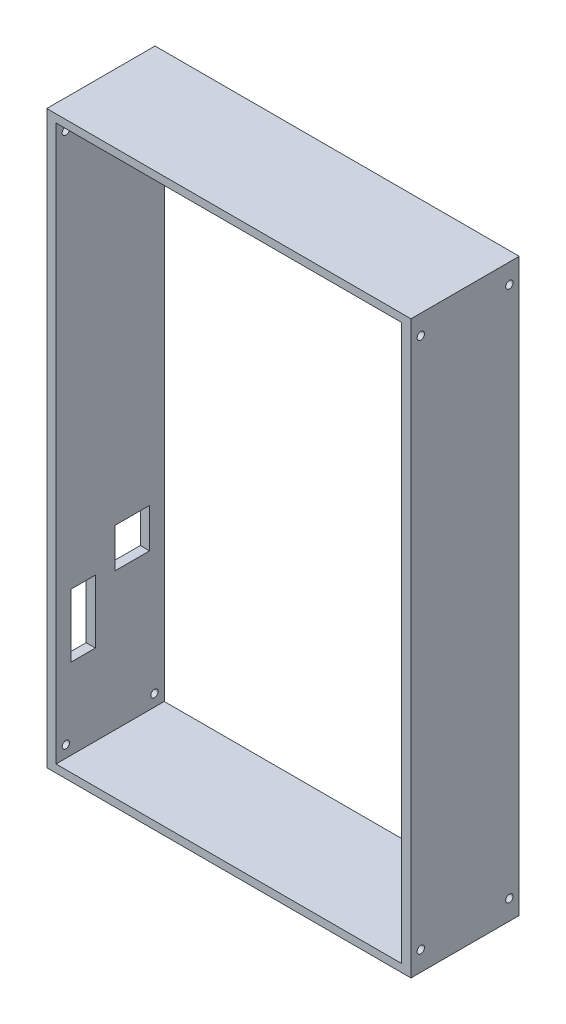
ISO-10303-21;
HEADER;
FILE_DESCRIPTION(('STEP AP214'),'2;1');
FILE_NAME('part.step','',(''),(''),'','','');
FILE_SCHEMA(('AUTOMOTIVE_DESIGN { 1 0 10303 214 1 1 1 1 }'));
ENDSEC;
DATA;
#1=APPLICATION_CONTEXT('core data for automotive mechanical design processes');
#2=APPLICATION_PROTOCOL_DEFINITION('international standard','automotive_design',2000,#1);
#3=PRODUCT_CONTEXT('',#1,'mechanical');
#4=PRODUCT('Part','Part','',(#3));
#5=PRODUCT_RELATED_PRODUCT_CATEGORY('part','',(#4));
#6=PRODUCT_DEFINITION_FORMATION('','',#4);
#7=PRODUCT_DEFINITION_CONTEXT('part definition',#1,'design');
#8=PRODUCT_DEFINITION('design','',#6,#7);
#9=PRODUCT_DEFINITION_SHAPE('','',#8);
#10=(LENGTH_UNIT() NAMED_UNIT(*) SI_UNIT(.MILLI.,.METRE.));
#11=(NAMED_UNIT(*) PLANE_ANGLE_UNIT() SI_UNIT($,.RADIAN.));
#12=(NAMED_UNIT(*) SI_UNIT($,.STERADIAN.) SOLID_ANGLE_UNIT());
#13=UNCERTAINTY_MEASURE_WITH_UNIT(LENGTH_MEASURE(1.E-05),#10,'distance_accuracy_value','');
#14=(GEOMETRIC_REPRESENTATION_CONTEXT(3) GLOBAL_UNCERTAINTY_ASSIGNED_CONTEXT((#13)) GLOBAL_UNIT_ASSIGNED_CONTEXT((#10,
#11,#12)) REPRESENTATION_CONTEXT('',''));
#15=CARTESIAN_POINT('',(0.,0.,0.));
#16=DIRECTION('',(0.,0.,1.));
#17=DIRECTION('',(1.,0.,0.));
#18=AXIS2_PLACEMENT_3D('',#15,#16,#17);
#19=CARTESIAN_POINT('',(0.,0.,34.925));
#20=DIRECTION('',(1.,0.,0.));
#21=DIRECTION('',(0.,0.,-1.));
#22=AXIS2_PLACEMENT_3D('',#19,#20,#21);
#23=PLANE('',#22);
#24=DIRECTION('',(0.,0.,1.));
#25=VECTOR('',#24,1.);
#26=CARTESIAN_POINT('',(0.,46.990100076,4.7625));
#27=LINE('',#26,#25);
#28=CARTESIAN_POINT('',(0.,46.990100076,4.7625));
#29=VERTEX_POINT('',#28);
#30=CARTESIAN_POINT('',(0.,46.990100076,15.875));
#31=VERTEX_POINT('',#30);
#32=EDGE_CURVE('E182',#29,#31,#27,.T.);
#33=ORIENTED_EDGE('',*,*,#32,.F.);
#34=DIRECTION('',(0.,-1.,0.));
#35=VECTOR('',#34,1.);
#36=CARTESIAN_POINT('',(0.,59.690100076,4.7625));
#37=LINE('',#36,#35);
#38=CARTESIAN_POINT('',(0.,59.690100076,4.7625));
#39=VERTEX_POINT('',#38);
#40=EDGE_CURVE('E48',#39,#29,#37,.T.);
#41=ORIENTED_EDGE('',*,*,#40,.F.);
#42=DIRECTION('',(0.,0.,-1.));
#43=VECTOR('',#42,1.);
#44=CARTESIAN_POINT('',(0.,59.690100076,4.7625));
#45=LINE('',#44,#43);
#46=CARTESIAN_POINT('',(0.,59.690100076,15.875));
#47=VERTEX_POINT('',#46);
#48=EDGE_CURVE('E188',#47,#39,#45,.T.);
#49=ORIENTED_EDGE('',*,*,#48,.F.);
#50=DIRECTION('',(0.,1.,0.));
#51=VECTOR('',#50,1.);
#52=CARTESIAN_POINT('',(0.,59.690100076,15.875));
#53=LINE('',#52,#51);
#54=EDGE_CURVE('E173',#31,#47,#53,.T.);
#55=ORIENTED_EDGE('',*,*,#54,.F.);
#56=EDGE_LOOP('',(#33,#41,#49,#55));
#57=FACE_BOUND('',#56,.T.);
#58=DIRECTION('',(0.,0.,1.));
#59=VECTOR('',#58,1.);
#60=CARTESIAN_POINT('',(0.,28.575100076,22.225));
#61=LINE('',#60,#59);
#62=CARTESIAN_POINT('',(0.,28.575100076,22.225));
#63=VERTEX_POINT('',#62);
#64=CARTESIAN_POINT('',(0.,28.575100076,30.1625));
#65=VERTEX_POINT('',#64);
#66=EDGE_CURVE('E199',#63,#65,#61,.T.);
#67=ORIENTED_EDGE('',*,*,#66,.F.);
#68=DIRECTION('',(0.,-1.,0.));
#69=VECTOR('',#68,1.);
#70=CARTESIAN_POINT('',(0.,48.958600076,22.225));
#71=LINE('',#70,#69);
#72=CARTESIAN_POINT('',(0.,48.958600076,22.225));
#73=VERTEX_POINT('',#72);
#74=EDGE_CURVE('E195',#73,#63,#71,.T.);
#75=ORIENTED_EDGE('',*,*,#74,.F.);
#76=DIRECTION('',(0.,0.,-1.));
#77=VECTOR('',#76,1.);
#78=CARTESIAN_POINT('',(0.,48.958600076,22.225));
#79=LINE('',#78,#77);
#80=CARTESIAN_POINT('',(0.,48.958600076,30.1625));
#81=VERTEX_POINT('',#80);
#82=EDGE_CURVE('E205',#81,#73,#79,.T.);
#83=ORIENTED_EDGE('',*,*,#82,.F.);
#84=DIRECTION('',(0.,1.,0.));
#85=VECTOR('',#84,1.);
#86=CARTESIAN_POINT('',(0.,48.958600076,30.1625));
#87=LINE('',#86,#85);
#88=EDGE_CURVE('E202',#65,#81,#87,.T.);
#89=ORIENTED_EDGE('',*,*,#88,.F.);
#90=EDGE_LOOP('',(#67,#75,#83,#89));
#91=FACE_BOUND('',#90,.T.);
#92=CARTESIAN_POINT('',(0.,6.34999999999999,31.75));
#93=DIRECTION('',(-1.,0.,0.));
#94=DIRECTION('',(0.,0.,1.));
#95=AXIS2_PLACEMENT_3D('',#92,#93,#94);
#96=CIRCLE('',#95,1.190625);
#97=CARTESIAN_POINT('',(0.,6.34999999999999,32.940625));
#98=VERTEX_POINT('',#97);
#99=EDGE_CURVE('E225',#98,#98,#96,.T.);
#100=ORIENTED_EDGE('',*,*,#99,.F.);
#101=EDGE_LOOP('',(#100));
#102=FACE_BOUND('',#101,.T.);
#103=CARTESIAN_POINT('',(0.,177.8,31.75));
#104=DIRECTION('',(-1.,0.,0.));
#105=DIRECTION('',(0.,0.,1.));
#106=AXIS2_PLACEMENT_3D('',#103,#104,#105);
#107=CIRCLE('',#106,1.19062500000001);
#108=CARTESIAN_POINT('',(0.,177.8,32.940625));
#109=VERTEX_POINT('',#108);
#110=EDGE_CURVE('E229',#109,#109,#107,.T.);
#111=ORIENTED_EDGE('',*,*,#110,.F.);
#112=EDGE_LOOP('',(#111));
#113=FACE_BOUND('',#112,.T.);
#114=CARTESIAN_POINT('',(0.,6.34999999999999,3.175));
#115=DIRECTION('',(-1.,0.,0.));
#116=DIRECTION('',(0.,0.,1.));
#117=AXIS2_PLACEMENT_3D('',#114,#115,#116);
#118=CIRCLE('',#117,1.190625);
#119=CARTESIAN_POINT('',(0.,6.34999999999999,4.365625));
#120=VERTEX_POINT('',#119);
#121=EDGE_CURVE('E233',#120,#120,#118,.T.);
#122=ORIENTED_EDGE('',*,*,#121,.F.);
#123=EDGE_LOOP('',(#122));
#124=FACE_BOUND('',#123,.T.);
#125=CARTESIAN_POINT('',(0.,177.8,3.175));
#126=DIRECTION('',(-1.,0.,0.));
#127=DIRECTION('',(0.,0.,1.));
#128=AXIS2_PLACEMENT_3D('',#125,#126,#127);
#129=CIRCLE('',#128,1.190625);
#130=CARTESIAN_POINT('',(0.,177.8,4.365625));
#131=VERTEX_POINT('',#130);
#132=EDGE_CURVE('E237',#131,#131,#129,.T.);
#133=ORIENTED_EDGE('',*,*,#132,.F.);
#134=EDGE_LOOP('',(#133));
#135=FACE_BOUND('',#134,.T.);
#136=DIRECTION('',(0.,-1.,0.));
#137=VECTOR('',#136,1.);
#138=CARTESIAN_POINT('',(0.,0.,34.925));
#139=LINE('',#138,#137);
#140=CARTESIAN_POINT('',(0.,184.149899924,34.925));
#141=VERTEX_POINT('',#140);
#142=CARTESIAN_POINT('',(0.,0.000100076,34.925));
#143=VERTEX_POINT('',#142);
#144=EDGE_CURVE('E282',#141,#143,#139,.T.);
#145=ORIENTED_EDGE('',*,*,#144,.F.);
#146=DIRECTION('',(0.,0.,-1.));
#147=VECTOR('',#146,1.);
#148=CARTESIAN_POINT('',(0.,184.149899924,34.925));
#149=LINE('',#148,#147);
#150=CARTESIAN_POINT('',(0.,184.149899924,0.));
#151=VERTEX_POINT('',#150);
#152=EDGE_CURVE('E307',#141,#151,#149,.T.);
#153=ORIENTED_EDGE('',*,*,#152,.T.);
#154=DIRECTION('',(0.,-1.,0.));
#155=VECTOR('',#154,1.);
#156=CARTESIAN_POINT('',(0.,0.,0.));
#157=LINE('',#156,#155);
#158=CARTESIAN_POINT('',(0.,0.000100076,0.));
#159=VERTEX_POINT('',#158);
#160=EDGE_CURVE('E275',#151,#159,#157,.T.);
#161=ORIENTED_EDGE('',*,*,#160,.T.);
#162=DIRECTION('',(0.,0.,-1.));
#163=VECTOR('',#162,1.);
#164=CARTESIAN_POINT('',(0.,0.000100076,34.925));
#165=LINE('',#164,#163);
#166=EDGE_CURVE('E295',#159,#143,#165,.F.);
#167=ORIENTED_EDGE('',*,*,#166,.T.);
#168=EDGE_LOOP('',(#145,#153,#161,#167));
#169=FACE_BOUND('',#168,.T.);
#170=ADVANCED_FACE('F33',(#57,#91,#102,#113,#124,#135,#169),#23,.F.);
#171=CARTESIAN_POINT('',(0.,0.,34.925));
#172=DIRECTION('',(0.,1.,0.));
#173=DIRECTION('',(0.,0.,1.));
#174=AXIS2_PLACEMENT_3D('',#171,#172,#173);
#175=PLANE('',#174);
#176=DIRECTION('',(1.,0.,0.));
#177=VECTOR('',#176,1.);
#178=CARTESIAN_POINT('',(0.,0.,34.925));
#179=LINE('',#178,#177);
#180=CARTESIAN_POINT('',(0.000100076,0.,34.925));
#181=VERTEX_POINT('',#180);
#182=CARTESIAN_POINT('',(117.474899924,0.,34.925));
#183=VERTEX_POINT('',#182);
#184=EDGE_CURVE('E285',#181,#183,#179,.T.);
#185=ORIENTED_EDGE('',*,*,#184,.F.);
#186=DIRECTION('',(0.,0.,-1.));
#187=VECTOR('',#186,1.);
#188=CARTESIAN_POINT('',(0.000100076,0.,34.925));
#189=LINE('',#188,#187);
#190=CARTESIAN_POINT('',(0.000100076,0.,0.));
#191=VERTEX_POINT('',#190);
#192=EDGE_CURVE('E333',#181,#191,#189,.T.);
#193=ORIENTED_EDGE('',*,*,#192,.T.);
#194=DIRECTION('',(1.,0.,0.));
#195=VECTOR('',#194,1.);
#196=CARTESIAN_POINT('',(0.,0.,0.));
#197=LINE('',#196,#195);
#198=CARTESIAN_POINT('',(117.474899924,0.,0.));
#199=VERTEX_POINT('',#198);
#200=EDGE_CURVE('E298',#191,#199,#197,.T.);
#201=ORIENTED_EDGE('',*,*,#200,.T.);
#202=DIRECTION('',(0.,0.,-1.));
#203=VECTOR('',#202,1.);
#204=CARTESIAN_POINT('',(117.474899924,0.,34.925));
#205=LINE('',#204,#203);
#206=EDGE_CURVE('E331',#199,#183,#205,.F.);
#207=ORIENTED_EDGE('',*,*,#206,.T.);
#208=EDGE_LOOP('',(#185,#193,#201,#207));
#209=FACE_BOUND('',#208,.T.);
#210=ADVANCED_FACE('F393',(#209),#175,.F.);
#211=CARTESIAN_POINT('',(117.475,0.,34.925));
#212=DIRECTION('',(-1.,0.,0.));
#213=DIRECTION('',(0.,0.,1.));
#214=AXIS2_PLACEMENT_3D('',#211,#212,#213);
#215=PLANE('',#214);
#216=CARTESIAN_POINT('',(117.475,6.35,31.75));
#217=DIRECTION('',(1.,0.,0.));
#218=DIRECTION('',(0.,0.,-1.));
#219=AXIS2_PLACEMENT_3D('',#216,#217,#218);
#220=CIRCLE('',#219,1.190625);
#221=CARTESIAN_POINT('',(117.475,6.35,30.559375));
#222=VERTEX_POINT('',#221);
#223=EDGE_CURVE('E211',#222,#222,#220,.T.);
#224=ORIENTED_EDGE('',*,*,#223,.F.);
#225=EDGE_LOOP('',(#224));
#226=FACE_BOUND('',#225,.T.);
#227=CARTESIAN_POINT('',(117.475,177.8,31.75));
#228=DIRECTION('',(1.,0.,0.));
#229=DIRECTION('',(0.,0.,-1.));
#230=AXIS2_PLACEMENT_3D('',#227,#228,#229);
#231=CIRCLE('',#230,1.190625);
#232=CARTESIAN_POINT('',(117.475,177.8,30.559375));
#233=VERTEX_POINT('',#232);
#234=EDGE_CURVE('E221',#233,#233,#231,.T.);
#235=ORIENTED_EDGE('',*,*,#234,.F.);
#236=EDGE_LOOP('',(#235));
#237=FACE_BOUND('',#236,.T.);
#238=CARTESIAN_POINT('',(117.475,6.35,3.175));
#239=DIRECTION('',(1.,0.,0.));
#240=DIRECTION('',(0.,0.,-1.));
#241=AXIS2_PLACEMENT_3D('',#238,#239,#240);
#242=CIRCLE('',#241,1.190625);
#243=CARTESIAN_POINT('',(117.475,6.35,1.984375));
#244=VERTEX_POINT('',#243);
#245=EDGE_CURVE('E241',#244,#244,#242,.T.);
#246=ORIENTED_EDGE('',*,*,#245,.F.);
#247=EDGE_LOOP('',(#246));
#248=FACE_BOUND('',#247,.T.);
#249=CARTESIAN_POINT('',(117.475,177.8,3.175));
#250=DIRECTION('',(1.,0.,0.));
#251=DIRECTION('',(0.,0.,-1.));
#252=AXIS2_PLACEMENT_3D('',#249,#250,#251);
#253=CIRCLE('',#252,1.190625);
#254=CARTESIAN_POINT('',(117.475,177.8,1.984375));
#255=VERTEX_POINT('',#254);
#256=EDGE_CURVE('E245',#255,#255,#253,.T.);
#257=ORIENTED_EDGE('',*,*,#256,.F.);
#258=EDGE_LOOP('',(#257));
#259=FACE_BOUND('',#258,.T.);
#260=DIRECTION('',(0.,1.,0.));
#261=VECTOR('',#260,1.);
#262=CARTESIAN_POINT('',(117.475,0.,34.925));
#263=LINE('',#262,#261);
#264=CARTESIAN_POINT('',(117.475,0.000100076,34.925));
#265=VERTEX_POINT('',#264);
#266=CARTESIAN_POINT('',(117.475,184.149899924,34.925));
#267=VERTEX_POINT('',#266);
#268=EDGE_CURVE('E289',#265,#267,#263,.T.);
#269=ORIENTED_EDGE('',*,*,#268,.F.);
#270=DIRECTION('',(0.,0.,-1.));
#271=VECTOR('',#270,1.);
#272=CARTESIAN_POINT('',(117.475,0.000100076,34.925));
#273=LINE('',#272,#271);
#274=CARTESIAN_POINT('',(117.475,0.000100076,0.));
#275=VERTEX_POINT('',#274);
#276=EDGE_CURVE('E338',#265,#275,#273,.T.);
#277=ORIENTED_EDGE('',*,*,#276,.T.);
#278=DIRECTION('',(0.,1.,0.));
#279=VECTOR('',#278,1.);
#280=CARTESIAN_POINT('',(117.475,0.,0.));
#281=LINE('',#280,#279);
#282=CARTESIAN_POINT('',(117.475,184.149899924,0.));
#283=VERTEX_POINT('',#282);
#284=EDGE_CURVE('E301',#275,#283,#281,.T.);
#285=ORIENTED_EDGE('',*,*,#284,.T.);
#286=DIRECTION('',(0.,0.,-1.));
#287=VECTOR('',#286,1.);
#288=CARTESIAN_POINT('',(117.475,184.149899924,34.925));
#289=LINE('',#288,#287);
#290=EDGE_CURVE('E336',#283,#267,#289,.F.);
#291=ORIENTED_EDGE('',*,*,#290,.T.);
#292=EDGE_LOOP('',(#269,#277,#285,#291));
#293=FACE_BOUND('',#292,.T.);
#294=ADVANCED_FACE('F398',(#226,#237,#248,#259,#293),#215,.F.);
#295=CARTESIAN_POINT('',(0.,184.15,34.925));
#296=DIRECTION('',(0.,-1.,0.));
#297=DIRECTION('',(0.,0.,-1.));
#298=AXIS2_PLACEMENT_3D('',#295,#296,#297);
#299=PLANE('',#298);
#300=DIRECTION('',(-1.,0.,0.));
#301=VECTOR('',#300,1.);
#302=CARTESIAN_POINT('',(0.,184.15,0.));
#303=LINE('',#302,#301);
#304=CARTESIAN_POINT('',(117.474899924,184.15,0.));
#305=VERTEX_POINT('',#304);
#306=CARTESIAN_POINT('',(0.000100076,184.15,0.));
#307=VERTEX_POINT('',#306);
#308=EDGE_CURVE('E286',#305,#307,#303,.T.);
#309=ORIENTED_EDGE('',*,*,#308,.T.);
#310=DIRECTION('',(0.,0.,-1.));
#311=VECTOR('',#310,1.);
#312=CARTESIAN_POINT('',(0.000100076,184.15,34.925));
#313=LINE('',#312,#311);
#314=CARTESIAN_POINT('',(0.000100076,184.15,34.925));
#315=VERTEX_POINT('',#314);
#316=EDGE_CURVE('E321',#307,#315,#313,.F.);
#317=ORIENTED_EDGE('',*,*,#316,.T.);
#318=DIRECTION('',(-1.,0.,0.));
#319=VECTOR('',#318,1.);
#320=CARTESIAN_POINT('',(0.,184.15,34.925));
#321=LINE('',#320,#319);
#322=CARTESIAN_POINT('',(117.474899924,184.15,34.925));
#323=VERTEX_POINT('',#322);
#324=EDGE_CURVE('E292',#323,#315,#321,.T.);
#325=ORIENTED_EDGE('',*,*,#324,.F.);
#326=DIRECTION('',(0.,0.,-1.));
#327=VECTOR('',#326,1.);
#328=CARTESIAN_POINT('',(117.474899924,184.15,34.925));
#329=LINE('',#328,#327);
#330=EDGE_CURVE('E318',#323,#305,#329,.T.);
#331=ORIENTED_EDGE('',*,*,#330,.T.);
#332=EDGE_LOOP('',(#309,#317,#325,#331));
#333=FACE_BOUND('',#332,.T.);
#334=ADVANCED_FACE('F434',(#333),#299,.F.);
#335=CARTESIAN_POINT('',(0.,0.,34.925));
#336=DIRECTION('',(0.,0.,-1.));
#337=DIRECTION('',(-1.,0.,0.));
#338=AXIS2_PLACEMENT_3D('',#335,#336,#337);
#339=PLANE('',#338);
#340=DIRECTION('',(1.,0.,0.));
#341=VECTOR('',#340,1.);
#342=CARTESIAN_POINT('',(2.98450000000003,2.54,34.925));
#343=LINE('',#342,#341);
#344=CARTESIAN_POINT('',(2.98450000000003,2.54,34.925));
#345=VERTEX_POINT('',#344);
#346=CARTESIAN_POINT('',(114.4905,2.54,34.925));
#347=VERTEX_POINT('',#346);
#348=EDGE_CURVE('E265',#345,#347,#343,.T.);
#349=ORIENTED_EDGE('',*,*,#348,.F.);
#350=DIRECTION('',(0.,-1.,0.));
#351=VECTOR('',#350,1.);
#352=CARTESIAN_POINT('',(2.98450000000001,181.61,34.925));
#353=LINE('',#352,#351);
#354=CARTESIAN_POINT('',(2.98450000000001,181.61,34.925));
#355=VERTEX_POINT('',#354);
#356=EDGE_CURVE('E263',#355,#345,#353,.T.);
#357=ORIENTED_EDGE('',*,*,#356,.F.);
#358=DIRECTION('',(-1.,0.,0.));
#359=VECTOR('',#358,1.);
#360=CARTESIAN_POINT('',(2.98450000000001,181.61,34.925));
#361=LINE('',#360,#359);
#362=CARTESIAN_POINT('',(114.4905,181.61,34.925));
#363=VERTEX_POINT('',#362);
#364=EDGE_CURVE('E253',#363,#355,#361,.T.);
#365=ORIENTED_EDGE('',*,*,#364,.F.);
#366=DIRECTION('',(0.,1.,0.));
#367=VECTOR('',#366,1.);
#368=CARTESIAN_POINT('',(114.4905,181.61,34.925));
#369=LINE('',#368,#367);
#370=EDGE_CURVE('E268',#347,#363,#369,.T.);
#371=ORIENTED_EDGE('',*,*,#370,.F.);
#372=EDGE_LOOP('',(#349,#357,#365,#371));
#373=FACE_BOUND('',#372,.T.);
#374=ORIENTED_EDGE('',*,*,#324,.T.);
#375=CARTESIAN_POINT('',(0.000100076,184.149899924,34.925));
#376=DIRECTION('',(0.,0.,-1.));
#377=DIRECTION('',(-1.,0.,0.));
#378=AXIS2_PLACEMENT_3D('',#375,#376,#377);
#379=CIRCLE('',#378,0.000100076);
#380=EDGE_CURVE('E329',#315,#141,#379,.F.);
#381=ORIENTED_EDGE('',*,*,#380,.T.);
#382=ORIENTED_EDGE('',*,*,#144,.T.);
#383=CARTESIAN_POINT('',(0.000100076,0.000100076,34.925));
#384=DIRECTION('',(0.,0.,-1.));
#385=DIRECTION('',(-1.,0.,0.));
#386=AXIS2_PLACEMENT_3D('',#383,#384,#385);
#387=CIRCLE('',#386,0.000100076);
#388=EDGE_CURVE('E327',#143,#181,#387,.F.);
#389=ORIENTED_EDGE('',*,*,#388,.T.);
#390=ORIENTED_EDGE('',*,*,#184,.T.);
#391=CARTESIAN_POINT('',(117.474899924,0.000100076,34.925));
#392=DIRECTION('',(0.,0.,-1.));
#393=DIRECTION('',(-1.,0.,0.));
#394=AXIS2_PLACEMENT_3D('',#391,#392,#393);
#395=CIRCLE('',#394,0.000100076);
#396=EDGE_CURVE('E325',#183,#265,#395,.F.);
#397=ORIENTED_EDGE('',*,*,#396,.T.);
#398=ORIENTED_EDGE('',*,*,#268,.T.);
#399=CARTESIAN_POINT('',(117.474899924,184.149899924,34.925));
#400=DIRECTION('',(0.,0.,-1.));
#401=DIRECTION('',(-1.,0.,0.));
#402=AXIS2_PLACEMENT_3D('',#399,#400,#401);
#403=CIRCLE('',#402,0.000100076);
#404=EDGE_CURVE('E323',#267,#323,#403,.F.);
#405=ORIENTED_EDGE('',*,*,#404,.T.);
#406=EDGE_LOOP('',(#374,#381,#382,#389,#390,#397,#398,#405));
#407=FACE_BOUND('',#406,.T.);
#408=ADVANCED_FACE('F424',(#373,#407),#339,.F.);
#409=CARTESIAN_POINT('',(0.,0.,0.));
#410=DIRECTION('',(0.,0.,-1.));
#411=DIRECTION('',(-1.,0.,0.));
#412=AXIS2_PLACEMENT_3D('',#409,#410,#411);
#413=PLANE('',#412);
#414=DIRECTION('',(0.,-1.,0.));
#415=VECTOR('',#414,1.);
#416=CARTESIAN_POINT('',(2.98450000000001,181.61,0.));
#417=LINE('',#416,#415);
#418=CARTESIAN_POINT('',(2.98450000000001,181.61,0.));
#419=VERTEX_POINT('',#418);
#420=CARTESIAN_POINT('',(2.98450000000003,2.54,0.));
#421=VERTEX_POINT('',#420);
#422=EDGE_CURVE('E249',#419,#421,#417,.T.);
#423=ORIENTED_EDGE('',*,*,#422,.T.);
#424=DIRECTION('',(1.,0.,0.));
#425=VECTOR('',#424,1.);
#426=CARTESIAN_POINT('',(2.98450000000003,2.54,0.));
#427=LINE('',#426,#425);
#428=CARTESIAN_POINT('',(114.4905,2.54,0.));
#429=VERTEX_POINT('',#428);
#430=EDGE_CURVE('E252',#421,#429,#427,.T.);
#431=ORIENTED_EDGE('',*,*,#430,.T.);
#432=DIRECTION('',(0.,1.,0.));
#433=VECTOR('',#432,1.);
#434=CARTESIAN_POINT('',(114.4905,181.61,0.));
#435=LINE('',#434,#433);
#436=CARTESIAN_POINT('',(114.4905,181.61,0.));
#437=VERTEX_POINT('',#436);
#438=EDGE_CURVE('E256',#429,#437,#435,.T.);
#439=ORIENTED_EDGE('',*,*,#438,.T.);
#440=DIRECTION('',(-1.,0.,0.));
#441=VECTOR('',#440,1.);
#442=CARTESIAN_POINT('',(2.98450000000001,181.61,0.));
#443=LINE('',#442,#441);
#444=EDGE_CURVE('E259',#437,#419,#443,.T.);
#445=ORIENTED_EDGE('',*,*,#444,.T.);
#446=EDGE_LOOP('',(#423,#431,#439,#445));
#447=FACE_BOUND('',#446,.T.);
#448=ORIENTED_EDGE('',*,*,#160,.F.);
#449=CARTESIAN_POINT('',(0.000100076,184.149899924,0.));
#450=DIRECTION('',(0.,0.,-1.));
#451=DIRECTION('',(-1.,0.,0.));
#452=AXIS2_PLACEMENT_3D('',#449,#450,#451);
#453=CIRCLE('',#452,0.000100076);
#454=EDGE_CURVE('E316',#151,#307,#453,.T.);
#455=ORIENTED_EDGE('',*,*,#454,.T.);
#456=ORIENTED_EDGE('',*,*,#308,.F.);
#457=CARTESIAN_POINT('',(117.474899924,184.149899924,0.));
#458=DIRECTION('',(0.,0.,-1.));
#459=DIRECTION('',(-1.,0.,0.));
#460=AXIS2_PLACEMENT_3D('',#457,#458,#459);
#461=CIRCLE('',#460,0.000100076);
#462=EDGE_CURVE('E310',#305,#283,#461,.T.);
#463=ORIENTED_EDGE('',*,*,#462,.T.);
#464=ORIENTED_EDGE('',*,*,#284,.F.);
#465=CARTESIAN_POINT('',(117.474899924,0.000100076,0.));
#466=DIRECTION('',(0.,0.,-1.));
#467=DIRECTION('',(-1.,0.,0.));
#468=AXIS2_PLACEMENT_3D('',#465,#466,#467);
#469=CIRCLE('',#468,0.000100076);
#470=EDGE_CURVE('E312',#275,#199,#469,.T.);
#471=ORIENTED_EDGE('',*,*,#470,.T.);
#472=ORIENTED_EDGE('',*,*,#200,.F.);
#473=CARTESIAN_POINT('',(0.000100076,0.000100076,0.));
#474=DIRECTION('',(0.,0.,-1.));
#475=DIRECTION('',(-1.,0.,0.));
#476=AXIS2_PLACEMENT_3D('',#473,#474,#475);
#477=CIRCLE('',#476,0.000100076);
#478=EDGE_CURVE('E314',#191,#159,#477,.T.);
#479=ORIENTED_EDGE('',*,*,#478,.T.);
#480=EDGE_LOOP('',(#448,#455,#456,#463,#464,#471,#472,#479));
#481=FACE_BOUND('',#480,.T.);
#482=ADVANCED_FACE('F446',(#447,#481),#413,.T.);
#483=CARTESIAN_POINT('',(2.98450000000001,181.61,0.));
#484=DIRECTION('',(-1.,0.,0.));
#485=DIRECTION('',(0.,-1.,0.));
#486=AXIS2_PLACEMENT_3D('',#483,#484,#485);
#487=PLANE('',#486);
#488=DIRECTION('',(0.,0.,-1.));
#489=VECTOR('',#488,1.);
#490=CARTESIAN_POINT('',(2.98450000000002,59.690100076,0.));
#491=LINE('',#490,#489);
#492=CARTESIAN_POINT('',(2.98450000000002,59.690100076,15.875));
#493=VERTEX_POINT('',#492);
#494=CARTESIAN_POINT('',(2.98450000000002,59.690100076,4.7625));
#495=VERTEX_POINT('',#494);
#496=EDGE_CURVE('E41',#493,#495,#491,.T.);
#497=ORIENTED_EDGE('',*,*,#496,.T.);
#498=DIRECTION('',(0.,-1.,0.));
#499=VECTOR('',#498,1.);
#500=CARTESIAN_POINT('',(2.98450000000001,181.61,4.76249999999997));
#501=LINE('',#500,#499);
#502=CARTESIAN_POINT('',(2.98450000000002,46.990100076,4.7625));
#503=VERTEX_POINT('',#502);
#504=EDGE_CURVE('E11',#495,#503,#501,.T.);
#505=ORIENTED_EDGE('',*,*,#504,.T.);
#506=DIRECTION('',(0.,0.,1.));
#507=VECTOR('',#506,1.);
#508=CARTESIAN_POINT('',(2.98450000000002,46.990100076,0.));
#509=LINE('',#508,#507);
#510=CARTESIAN_POINT('',(2.98450000000002,46.990100076,15.875));
#511=VERTEX_POINT('',#510);
#512=EDGE_CURVE('E369',#503,#511,#509,.T.);
#513=ORIENTED_EDGE('',*,*,#512,.T.);
#514=DIRECTION('',(0.,1.,0.));
#515=VECTOR('',#514,1.);
#516=CARTESIAN_POINT('',(2.98450000000001,181.61,15.875));
#517=LINE('',#516,#515);
#518=EDGE_CURVE('E176',#511,#493,#517,.T.);
#519=ORIENTED_EDGE('',*,*,#518,.T.);
#520=EDGE_LOOP('',(#497,#505,#513,#519));
#521=FACE_BOUND('',#520,.T.);
#522=DIRECTION('',(0.,0.,-1.));
#523=VECTOR('',#522,1.);
#524=CARTESIAN_POINT('',(2.98450000000002,48.958600076,0.));
#525=LINE('',#524,#523);
#526=CARTESIAN_POINT('',(2.98450000000002,48.958600076,30.1625));
#527=VERTEX_POINT('',#526);
#528=CARTESIAN_POINT('',(2.98450000000002,48.958600076,22.225));
#529=VERTEX_POINT('',#528);
#530=EDGE_CURVE('E363',#527,#529,#525,.T.);
#531=ORIENTED_EDGE('',*,*,#530,.T.);
#532=DIRECTION('',(0.,-1.,0.));
#533=VECTOR('',#532,1.);
#534=CARTESIAN_POINT('',(2.98450000000001,181.61,22.225));
#535=LINE('',#534,#533);
#536=CARTESIAN_POINT('',(2.98450000000003,28.575100076,22.225));
#537=VERTEX_POINT('',#536);
#538=EDGE_CURVE('E366',#529,#537,#535,.T.);
#539=ORIENTED_EDGE('',*,*,#538,.T.);
#540=DIRECTION('',(0.,0.,1.));
#541=VECTOR('',#540,1.);
#542=CARTESIAN_POINT('',(2.98450000000003,28.575100076,0.));
#543=LINE('',#542,#541);
#544=CARTESIAN_POINT('',(2.98450000000003,28.575100076,30.1625));
#545=VERTEX_POINT('',#544);
#546=EDGE_CURVE('E341',#537,#545,#543,.T.);
#547=ORIENTED_EDGE('',*,*,#546,.T.);
#548=DIRECTION('',(0.,1.,0.));
#549=VECTOR('',#548,1.);
#550=CARTESIAN_POINT('',(2.98450000000001,181.61,30.1625));
#551=LINE('',#550,#549);
#552=EDGE_CURVE('E360',#545,#527,#551,.T.);
#553=ORIENTED_EDGE('',*,*,#552,.T.);
#554=EDGE_LOOP('',(#531,#539,#547,#553));
#555=FACE_BOUND('',#554,.T.);
#556=CARTESIAN_POINT('',(2.98450000000003,6.34999999999999,31.75));
#557=DIRECTION('',(-1.,0.,0.));
#558=DIRECTION('',(0.,-1.,0.));
#559=AXIS2_PLACEMENT_3D('',#556,#557,#558);
#560=CIRCLE('',#559,1.190625);
#561=CARTESIAN_POINT('',(2.98450000000003,5.15937499999999,31.75));
#562=VERTEX_POINT('',#561);
#563=EDGE_CURVE('E228',#562,#562,#560,.T.);
#564=ORIENTED_EDGE('',*,*,#563,.T.);
#565=EDGE_LOOP('',(#564));
#566=FACE_BOUND('',#565,.T.);
#567=CARTESIAN_POINT('',(2.98450000000001,177.8,31.75));
#568=DIRECTION('',(-1.,0.,0.));
#569=DIRECTION('',(0.,-1.,0.));
#570=AXIS2_PLACEMENT_3D('',#567,#568,#569);
#571=CIRCLE('',#570,1.19062500000001);
#572=CARTESIAN_POINT('',(2.98450000000001,176.609375,31.75));
#573=VERTEX_POINT('',#572);
#574=EDGE_CURVE('E232',#573,#573,#571,.T.);
#575=ORIENTED_EDGE('',*,*,#574,.T.);
#576=EDGE_LOOP('',(#575));
#577=FACE_BOUND('',#576,.T.);
#578=CARTESIAN_POINT('',(2.98450000000003,6.34999999999999,3.175));
#579=DIRECTION('',(-1.,0.,0.));
#580=DIRECTION('',(0.,-1.,0.));
#581=AXIS2_PLACEMENT_3D('',#578,#579,#580);
#582=CIRCLE('',#581,1.190625);
#583=CARTESIAN_POINT('',(2.98450000000003,5.15937499999999,3.175));
#584=VERTEX_POINT('',#583);
#585=EDGE_CURVE('E236',#584,#584,#582,.T.);
#586=ORIENTED_EDGE('',*,*,#585,.T.);
#587=EDGE_LOOP('',(#586));
#588=FACE_BOUND('',#587,.T.);
#589=CARTESIAN_POINT('',(2.98450000000001,177.8,3.175));
#590=DIRECTION('',(-1.,0.,0.));
#591=DIRECTION('',(0.,-1.,0.));
#592=AXIS2_PLACEMENT_3D('',#589,#590,#591);
#593=CIRCLE('',#592,1.190625);
#594=CARTESIAN_POINT('',(2.98450000000001,176.609375,3.175));
#595=VERTEX_POINT('',#594);
#596=EDGE_CURVE('E240',#595,#595,#593,.T.);
#597=ORIENTED_EDGE('',*,*,#596,.T.);
#598=EDGE_LOOP('',(#597));
#599=FACE_BOUND('',#598,.T.);
#600=ORIENTED_EDGE('',*,*,#356,.T.);
#601=DIRECTION('',(0.,0.,1.));
#602=VECTOR('',#601,1.);
#603=CARTESIAN_POINT('',(2.98450000000003,2.54,0.));
#604=LINE('',#603,#602);
#605=EDGE_CURVE('E262',#421,#345,#604,.T.);
#606=ORIENTED_EDGE('',*,*,#605,.F.);
#607=ORIENTED_EDGE('',*,*,#422,.F.);
#608=DIRECTION('',(0.,0.,1.));
#609=VECTOR('',#608,1.);
#610=CARTESIAN_POINT('',(2.98450000000001,181.61,0.));
#611=LINE('',#610,#609);
#612=EDGE_CURVE('E273',#419,#355,#611,.T.);
#613=ORIENTED_EDGE('',*,*,#612,.T.);
#614=EDGE_LOOP('',(#600,#606,#607,#613));
#615=FACE_BOUND('',#614,.T.);
#616=ADVANCED_FACE('F373',(#521,#555,#566,#577,#588,#599,#615),#487,.F.);
#617=CARTESIAN_POINT('',(2.98450000000001,181.61,0.));
#618=DIRECTION('',(0.,1.,0.));
#619=DIRECTION('',(0.,0.,1.));
#620=AXIS2_PLACEMENT_3D('',#617,#618,#619);
#621=PLANE('',#620);
#622=ORIENTED_EDGE('',*,*,#364,.T.);
#623=ORIENTED_EDGE('',*,*,#612,.F.);
#624=ORIENTED_EDGE('',*,*,#444,.F.);
#625=DIRECTION('',(0.,0.,1.));
#626=VECTOR('',#625,1.);
#627=CARTESIAN_POINT('',(114.4905,181.61,0.));
#628=LINE('',#627,#626);
#629=EDGE_CURVE('E276',#437,#363,#628,.T.);
#630=ORIENTED_EDGE('',*,*,#629,.T.);
#631=EDGE_LOOP('',(#622,#623,#624,#630));
#632=FACE_BOUND('',#631,.T.);
#633=ADVANCED_FACE('F454',(#632),#621,.F.);
#634=CARTESIAN_POINT('',(114.4905,181.61,0.));
#635=DIRECTION('',(1.,0.,0.));
#636=DIRECTION('',(0.,1.,0.));
#637=AXIS2_PLACEMENT_3D('',#634,#635,#636);
#638=PLANE('',#637);
#639=CARTESIAN_POINT('',(114.4905,6.35,31.75));
#640=DIRECTION('',(1.,0.,0.));
#641=DIRECTION('',(0.,1.,0.));
#642=AXIS2_PLACEMENT_3D('',#639,#640,#641);
#643=CIRCLE('',#642,1.190625);
#644=CARTESIAN_POINT('',(114.4905,7.540625,31.75));
#645=VERTEX_POINT('',#644);
#646=EDGE_CURVE('E220',#645,#645,#643,.T.);
#647=ORIENTED_EDGE('',*,*,#646,.T.);
#648=EDGE_LOOP('',(#647));
#649=FACE_BOUND('',#648,.T.);
#650=CARTESIAN_POINT('',(114.4905,177.8,31.75));
#651=DIRECTION('',(1.,0.,0.));
#652=DIRECTION('',(0.,1.,0.));
#653=AXIS2_PLACEMENT_3D('',#650,#651,#652);
#654=CIRCLE('',#653,1.190625);
#655=CARTESIAN_POINT('',(114.4905,178.990625,31.75));
#656=VERTEX_POINT('',#655);
#657=EDGE_CURVE('E224',#656,#656,#654,.T.);
#658=ORIENTED_EDGE('',*,*,#657,.T.);
#659=EDGE_LOOP('',(#658));
#660=FACE_BOUND('',#659,.T.);
#661=CARTESIAN_POINT('',(114.4905,6.35,3.175));
#662=DIRECTION('',(1.,0.,0.));
#663=DIRECTION('',(0.,1.,0.));
#664=AXIS2_PLACEMENT_3D('',#661,#662,#663);
#665=CIRCLE('',#664,1.190625);
#666=CARTESIAN_POINT('',(114.4905,7.540625,3.175));
#667=VERTEX_POINT('',#666);
#668=EDGE_CURVE('E244',#667,#667,#665,.T.);
#669=ORIENTED_EDGE('',*,*,#668,.T.);
#670=EDGE_LOOP('',(#669));
#671=FACE_BOUND('',#670,.T.);
#672=CARTESIAN_POINT('',(114.4905,177.8,3.175));
#673=DIRECTION('',(1.,0.,0.));
#674=DIRECTION('',(0.,1.,0.));
#675=AXIS2_PLACEMENT_3D('',#672,#673,#674);
#676=CIRCLE('',#675,1.190625);
#677=CARTESIAN_POINT('',(114.4905,178.990625,3.175));
#678=VERTEX_POINT('',#677);
#679=EDGE_CURVE('E248',#678,#678,#676,.T.);
#680=ORIENTED_EDGE('',*,*,#679,.T.);
#681=EDGE_LOOP('',(#680));
#682=FACE_BOUND('',#681,.T.);
#683=ORIENTED_EDGE('',*,*,#370,.T.);
#684=ORIENTED_EDGE('',*,*,#629,.F.);
#685=ORIENTED_EDGE('',*,*,#438,.F.);
#686=DIRECTION('',(0.,0.,1.));
#687=VECTOR('',#686,1.);
#688=CARTESIAN_POINT('',(114.4905,2.54,0.));
#689=LINE('',#688,#687);
#690=EDGE_CURVE('E278',#429,#347,#689,.T.);
#691=ORIENTED_EDGE('',*,*,#690,.T.);
#692=EDGE_LOOP('',(#683,#684,#685,#691));
#693=FACE_BOUND('',#692,.T.);
#694=ADVANCED_FACE('F478',(#649,#660,#671,#682,#693),#638,.F.);
#695=CARTESIAN_POINT('',(2.98450000000003,2.54,0.));
#696=DIRECTION('',(0.,-1.,0.));
#697=DIRECTION('',(1.,0.,0.));
#698=AXIS2_PLACEMENT_3D('',#695,#696,#697);
#699=PLANE('',#698);
#700=ORIENTED_EDGE('',*,*,#348,.T.);
#701=ORIENTED_EDGE('',*,*,#690,.F.);
#702=ORIENTED_EDGE('',*,*,#430,.F.);
#703=ORIENTED_EDGE('',*,*,#605,.T.);
#704=EDGE_LOOP('',(#700,#701,#702,#703));
#705=FACE_BOUND('',#704,.T.);
#706=ADVANCED_FACE('F407',(#705),#699,.F.);
#707=CARTESIAN_POINT('',(0.000100076,184.149899924,34.925));
#708=DIRECTION('',(0.,0.,-1.));
#709=DIRECTION('',(-1.,0.,0.));
#710=AXIS2_PLACEMENT_3D('',#707,#708,#709);
#711=CYLINDRICAL_SURFACE('',#710,0.000100076);
#712=ORIENTED_EDGE('',*,*,#380,.F.);
#713=ORIENTED_EDGE('',*,*,#316,.F.);
#714=ORIENTED_EDGE('',*,*,#454,.F.);
#715=ORIENTED_EDGE('',*,*,#152,.F.);
#716=EDGE_LOOP('',(#712,#713,#714,#715));
#717=FACE_BOUND('',#716,.T.);
#718=ADVANCED_FACE('F403',(#717),#711,.T.);
#719=CARTESIAN_POINT('',(0.000100076,0.000100076,34.925));
#720=DIRECTION('',(0.,0.,-1.));
#721=DIRECTION('',(-1.,0.,0.));
#722=AXIS2_PLACEMENT_3D('',#719,#720,#721);
#723=CYLINDRICAL_SURFACE('',#722,0.000100076);
#724=ORIENTED_EDGE('',*,*,#388,.F.);
#725=ORIENTED_EDGE('',*,*,#166,.F.);
#726=ORIENTED_EDGE('',*,*,#478,.F.);
#727=ORIENTED_EDGE('',*,*,#192,.F.);
#728=EDGE_LOOP('',(#724,#725,#726,#727));
#729=FACE_BOUND('',#728,.T.);
#730=ADVANCED_FACE('F406',(#729),#723,.T.);
#731=CARTESIAN_POINT('',(117.474899924,0.000100076,34.925));
#732=DIRECTION('',(0.,0.,-1.));
#733=DIRECTION('',(-1.,0.,0.));
#734=AXIS2_PLACEMENT_3D('',#731,#732,#733);
#735=CYLINDRICAL_SURFACE('',#734,0.000100076);
#736=ORIENTED_EDGE('',*,*,#396,.F.);
#737=ORIENTED_EDGE('',*,*,#206,.F.);
#738=ORIENTED_EDGE('',*,*,#470,.F.);
#739=ORIENTED_EDGE('',*,*,#276,.F.);
#740=EDGE_LOOP('',(#736,#737,#738,#739));
#741=FACE_BOUND('',#740,.T.);
#742=ADVANCED_FACE('F410',(#741),#735,.T.);
#743=CARTESIAN_POINT('',(117.474899924,184.149899924,34.925));
#744=DIRECTION('',(0.,0.,-1.));
#745=DIRECTION('',(-1.,0.,0.));
#746=AXIS2_PLACEMENT_3D('',#743,#744,#745);
#747=CYLINDRICAL_SURFACE('',#746,0.000100076);
#748=ORIENTED_EDGE('',*,*,#404,.F.);
#749=ORIENTED_EDGE('',*,*,#290,.F.);
#750=ORIENTED_EDGE('',*,*,#462,.F.);
#751=ORIENTED_EDGE('',*,*,#330,.F.);
#752=EDGE_LOOP('',(#748,#749,#750,#751));
#753=FACE_BOUND('',#752,.T.);
#754=ADVANCED_FACE('F35',(#753),#747,.T.);
#755=CARTESIAN_POINT('',(82.55,177.8,3.175));
#756=DIRECTION('',(1.,0.,0.));
#757=DIRECTION('',(0.,0.,-1.));
#758=AXIS2_PLACEMENT_3D('',#755,#756,#757);
#759=CYLINDRICAL_SURFACE('',#758,1.190625);
#760=ORIENTED_EDGE('',*,*,#256,.T.);
#761=EDGE_LOOP('',(#760));
#762=FACE_BOUND('',#761,.T.);
#763=ORIENTED_EDGE('',*,*,#679,.F.);
#764=EDGE_LOOP('',(#763));
#765=FACE_BOUND('',#764,.T.);
#766=ADVANCED_FACE('F417',(#762,#765),#759,.F.);
#767=CARTESIAN_POINT('',(82.55,6.35,3.175));
#768=DIRECTION('',(1.,0.,0.));
#769=DIRECTION('',(0.,0.,-1.));
#770=AXIS2_PLACEMENT_3D('',#767,#768,#769);
#771=CYLINDRICAL_SURFACE('',#770,1.190625);
#772=ORIENTED_EDGE('',*,*,#245,.T.);
#773=EDGE_LOOP('',(#772));
#774=FACE_BOUND('',#773,.T.);
#775=ORIENTED_EDGE('',*,*,#668,.F.);
#776=EDGE_LOOP('',(#775));
#777=FACE_BOUND('',#776,.T.);
#778=ADVANCED_FACE('F474',(#774,#777),#771,.F.);
#779=CARTESIAN_POINT('',(34.925,177.8,3.175));
#780=DIRECTION('',(-1.,0.,0.));
#781=DIRECTION('',(0.,0.,1.));
#782=AXIS2_PLACEMENT_3D('',#779,#780,#781);
#783=CYLINDRICAL_SURFACE('',#782,1.190625);
#784=ORIENTED_EDGE('',*,*,#132,.T.);
#785=EDGE_LOOP('',(#784));
#786=FACE_BOUND('',#785,.T.);
#787=ORIENTED_EDGE('',*,*,#596,.F.);
#788=EDGE_LOOP('',(#787));
#789=FACE_BOUND('',#788,.T.);
#790=ADVANCED_FACE('F503',(#786,#789),#783,.F.);
#791=CARTESIAN_POINT('',(34.925,6.34999999999999,3.175));
#792=DIRECTION('',(-1.,0.,0.));
#793=DIRECTION('',(0.,0.,1.));
#794=AXIS2_PLACEMENT_3D('',#791,#792,#793);
#795=CYLINDRICAL_SURFACE('',#794,1.190625);
#796=ORIENTED_EDGE('',*,*,#121,.T.);
#797=EDGE_LOOP('',(#796));
#798=FACE_BOUND('',#797,.T.);
#799=ORIENTED_EDGE('',*,*,#585,.F.);
#800=EDGE_LOOP('',(#799));
#801=FACE_BOUND('',#800,.T.);
#802=ADVANCED_FACE('F507',(#798,#801),#795,.F.);
#803=CARTESIAN_POINT('',(34.925,177.8,31.75));
#804=DIRECTION('',(-1.,0.,0.));
#805=DIRECTION('',(0.,0.,1.));
#806=AXIS2_PLACEMENT_3D('',#803,#804,#805);
#807=CYLINDRICAL_SURFACE('',#806,1.19062500000001);
#808=ORIENTED_EDGE('',*,*,#110,.T.);
#809=EDGE_LOOP('',(#808));
#810=FACE_BOUND('',#809,.T.);
#811=ORIENTED_EDGE('',*,*,#574,.F.);
#812=EDGE_LOOP('',(#811));
#813=FACE_BOUND('',#812,.T.);
#814=ADVANCED_FACE('F511',(#810,#813),#807,.F.);
#815=CARTESIAN_POINT('',(34.925,6.34999999999999,31.75));
#816=DIRECTION('',(-1.,0.,0.));
#817=DIRECTION('',(0.,0.,1.));
#818=AXIS2_PLACEMENT_3D('',#815,#816,#817);
#819=CYLINDRICAL_SURFACE('',#818,1.190625);
#820=ORIENTED_EDGE('',*,*,#99,.T.);
#821=EDGE_LOOP('',(#820));
#822=FACE_BOUND('',#821,.T.);
#823=ORIENTED_EDGE('',*,*,#563,.F.);
#824=EDGE_LOOP('',(#823));
#825=FACE_BOUND('',#824,.T.);
#826=ADVANCED_FACE('F515',(#822,#825),#819,.F.);
#827=CARTESIAN_POINT('',(82.55,177.8,31.75));
#828=DIRECTION('',(1.,0.,0.));
#829=DIRECTION('',(0.,0.,-1.));
#830=AXIS2_PLACEMENT_3D('',#827,#828,#829);
#831=CYLINDRICAL_SURFACE('',#830,1.190625);
#832=ORIENTED_EDGE('',*,*,#234,.T.);
#833=EDGE_LOOP('',(#832));
#834=FACE_BOUND('',#833,.T.);
#835=ORIENTED_EDGE('',*,*,#657,.F.);
#836=EDGE_LOOP('',(#835));
#837=FACE_BOUND('',#836,.T.);
#838=ADVANCED_FACE('F519',(#834,#837),#831,.F.);
#839=CARTESIAN_POINT('',(82.55,6.35,31.75));
#840=DIRECTION('',(1.,0.,0.));
#841=DIRECTION('',(0.,0.,-1.));
#842=AXIS2_PLACEMENT_3D('',#839,#840,#841);
#843=CYLINDRICAL_SURFACE('',#842,1.190625);
#844=ORIENTED_EDGE('',*,*,#223,.T.);
#845=EDGE_LOOP('',(#844));
#846=FACE_BOUND('',#845,.T.);
#847=ORIENTED_EDGE('',*,*,#646,.F.);
#848=EDGE_LOOP('',(#847));
#849=FACE_BOUND('',#848,.T.);
#850=ADVANCED_FACE('F523',(#846,#849),#843,.F.);
#851=CARTESIAN_POINT('',(3.175,48.958600076,22.225));
#852=DIRECTION('',(0.,0.,-1.));
#853=DIRECTION('',(0.,1.,0.));
#854=AXIS2_PLACEMENT_3D('',#851,#852,#853);
#855=PLANE('',#854);
#856=DIRECTION('',(-1.,0.,0.));
#857=VECTOR('',#856,1.);
#858=CARTESIAN_POINT('',(3.175,48.958600076,22.225));
#859=LINE('',#858,#857);
#860=EDGE_CURVE('E209',#529,#73,#859,.T.);
#861=ORIENTED_EDGE('',*,*,#860,.T.);
#862=ORIENTED_EDGE('',*,*,#74,.T.);
#863=DIRECTION('',(-1.,0.,0.));
#864=VECTOR('',#863,1.);
#865=CARTESIAN_POINT('',(3.175,28.575100076,22.225));
#866=LINE('',#865,#864);
#867=EDGE_CURVE('E208',#537,#63,#866,.T.);
#868=ORIENTED_EDGE('',*,*,#867,.F.);
#869=ORIENTED_EDGE('',*,*,#538,.F.);
#870=EDGE_LOOP('',(#861,#862,#868,#869));
#871=FACE_BOUND('',#870,.T.);
#872=ADVANCED_FACE('F527',(#871),#855,.F.);
#873=CARTESIAN_POINT('',(3.175,48.958600076,22.225));
#874=DIRECTION('',(0.,1.,0.));
#875=DIRECTION('',(0.,0.,1.));
#876=AXIS2_PLACEMENT_3D('',#873,#874,#875);
#877=PLANE('',#876);
#878=DIRECTION('',(-1.,0.,0.));
#879=VECTOR('',#878,1.);
#880=CARTESIAN_POINT('',(3.175,48.958600076,30.1625));
#881=LINE('',#880,#879);
#882=EDGE_CURVE('E212',#527,#81,#881,.T.);
#883=ORIENTED_EDGE('',*,*,#882,.T.);
#884=ORIENTED_EDGE('',*,*,#82,.T.);
#885=ORIENTED_EDGE('',*,*,#860,.F.);
#886=ORIENTED_EDGE('',*,*,#530,.F.);
#887=EDGE_LOOP('',(#883,#884,#885,#886));
#888=FACE_BOUND('',#887,.T.);
#889=ADVANCED_FACE('F530',(#888),#877,.F.);
#890=CARTESIAN_POINT('',(3.175,48.958600076,30.1625));
#891=DIRECTION('',(0.,0.,1.));
#892=DIRECTION('',(0.,-1.,0.));
#893=AXIS2_PLACEMENT_3D('',#890,#891,#892);
#894=PLANE('',#893);
#895=DIRECTION('',(-1.,0.,0.));
#896=VECTOR('',#895,1.);
#897=CARTESIAN_POINT('',(3.175,28.575100076,30.1625));
#898=LINE('',#897,#896);
#899=EDGE_CURVE('E214',#545,#65,#898,.T.);
#900=ORIENTED_EDGE('',*,*,#899,.T.);
#901=ORIENTED_EDGE('',*,*,#88,.T.);
#902=ORIENTED_EDGE('',*,*,#882,.F.);
#903=ORIENTED_EDGE('',*,*,#552,.F.);
#904=EDGE_LOOP('',(#900,#901,#902,#903));
#905=FACE_BOUND('',#904,.T.);
#906=ADVANCED_FACE('F387',(#905),#894,.F.);
#907=CARTESIAN_POINT('',(3.175,28.575100076,22.225));
#908=DIRECTION('',(0.,-1.,0.));
#909=DIRECTION('',(0.,0.,-1.));
#910=AXIS2_PLACEMENT_3D('',#907,#908,#909);
#911=PLANE('',#910);
#912=ORIENTED_EDGE('',*,*,#867,.T.);
#913=ORIENTED_EDGE('',*,*,#66,.T.);
#914=ORIENTED_EDGE('',*,*,#899,.F.);
#915=ORIENTED_EDGE('',*,*,#546,.F.);
#916=EDGE_LOOP('',(#912,#913,#914,#915));
#917=FACE_BOUND('',#916,.T.);
#918=ADVANCED_FACE('F380',(#917),#911,.F.);
#919=CARTESIAN_POINT('',(25.4,59.690100076,4.7625));
#920=DIRECTION('',(0.,0.,-1.));
#921=DIRECTION('',(0.,1.,0.));
#922=AXIS2_PLACEMENT_3D('',#919,#920,#921);
#923=PLANE('',#922);
#924=DIRECTION('',(-1.,0.,0.));
#925=VECTOR('',#924,1.);
#926=CARTESIAN_POINT('',(25.4,59.690100076,4.7625));
#927=LINE('',#926,#925);
#928=EDGE_CURVE('E193',#495,#39,#927,.T.);
#929=ORIENTED_EDGE('',*,*,#928,.T.);
#930=ORIENTED_EDGE('',*,*,#40,.T.);
#931=DIRECTION('',(-1.,0.,0.));
#932=VECTOR('',#931,1.);
#933=CARTESIAN_POINT('',(25.4,46.990100076,4.7625));
#934=LINE('',#933,#932);
#935=EDGE_CURVE('E179',#503,#29,#934,.T.);
#936=ORIENTED_EDGE('',*,*,#935,.F.);
#937=ORIENTED_EDGE('',*,*,#504,.F.);
#938=EDGE_LOOP('',(#929,#930,#936,#937));
#939=FACE_BOUND('',#938,.T.);
#940=ADVANCED_FACE('F378',(#939),#923,.F.);
#941=CARTESIAN_POINT('',(25.4,59.690100076,4.7625));
#942=DIRECTION('',(0.,1.,0.));
#943=DIRECTION('',(0.,0.,1.));
#944=AXIS2_PLACEMENT_3D('',#941,#942,#943);
#945=PLANE('',#944);
#946=DIRECTION('',(-1.,0.,0.));
#947=VECTOR('',#946,1.);
#948=CARTESIAN_POINT('',(25.4,59.690100076,15.875));
#949=LINE('',#948,#947);
#950=EDGE_CURVE('E178',#493,#47,#949,.T.);
#951=ORIENTED_EDGE('',*,*,#950,.T.);
#952=ORIENTED_EDGE('',*,*,#48,.T.);
#953=ORIENTED_EDGE('',*,*,#928,.F.);
#954=ORIENTED_EDGE('',*,*,#496,.F.);
#955=EDGE_LOOP('',(#951,#952,#953,#954));
#956=FACE_BOUND('',#955,.T.);
#957=ADVANCED_FACE('F377',(#956),#945,.F.);
#958=CARTESIAN_POINT('',(25.4,59.690100076,15.875));
#959=DIRECTION('',(0.,0.,1.));
#960=DIRECTION('',(1.,0.,0.));
#961=AXIS2_PLACEMENT_3D('',#958,#959,#960);
#962=PLANE('',#961);
#963=DIRECTION('',(-1.,0.,0.));
#964=VECTOR('',#963,1.);
#965=CARTESIAN_POINT('',(25.4,46.990100076,15.875));
#966=LINE('',#965,#964);
#967=EDGE_CURVE('E56',#511,#31,#966,.T.);
#968=ORIENTED_EDGE('',*,*,#967,.T.);
#969=ORIENTED_EDGE('',*,*,#54,.T.);
#970=ORIENTED_EDGE('',*,*,#950,.F.);
#971=ORIENTED_EDGE('',*,*,#518,.F.);
#972=EDGE_LOOP('',(#968,#969,#970,#971));
#973=FACE_BOUND('',#972,.T.);
#974=ADVANCED_FACE('F170',(#973),#962,.F.);
#975=CARTESIAN_POINT('',(25.4,46.990100076,4.7625));
#976=DIRECTION('',(0.,-1.,0.));
#977=DIRECTION('',(0.,0.,-1.));
#978=AXIS2_PLACEMENT_3D('',#975,#976,#977);
#979=PLANE('',#978);
#980=ORIENTED_EDGE('',*,*,#935,.T.);
#981=ORIENTED_EDGE('',*,*,#32,.T.);
#982=ORIENTED_EDGE('',*,*,#967,.F.);
#983=ORIENTED_EDGE('',*,*,#512,.F.);
#984=EDGE_LOOP('',(#980,#981,#982,#983));
#985=FACE_BOUND('',#984,.T.);
#986=ADVANCED_FACE('F183',(#985),#979,.F.);
#987=CLOSED_SHELL('',(#170,#210,#294,#334,#408,#482,#616,#633,#694,#706,#718,#730,#742,#754,
#766,#778,#790,#802,#814,#826,#838,#850,#872,#889,#906,#918,#940,#957,#974,#986));
#988=MANIFOLD_SOLID_BREP('B2',#987);
#989=ADVANCED_BREP_SHAPE_REPRESENTATION('',(#18,#988),#14);
#990=SHAPE_DEFINITION_REPRESENTATION(#9,#989);
ENDSEC;
END-ISO-10303-21;
